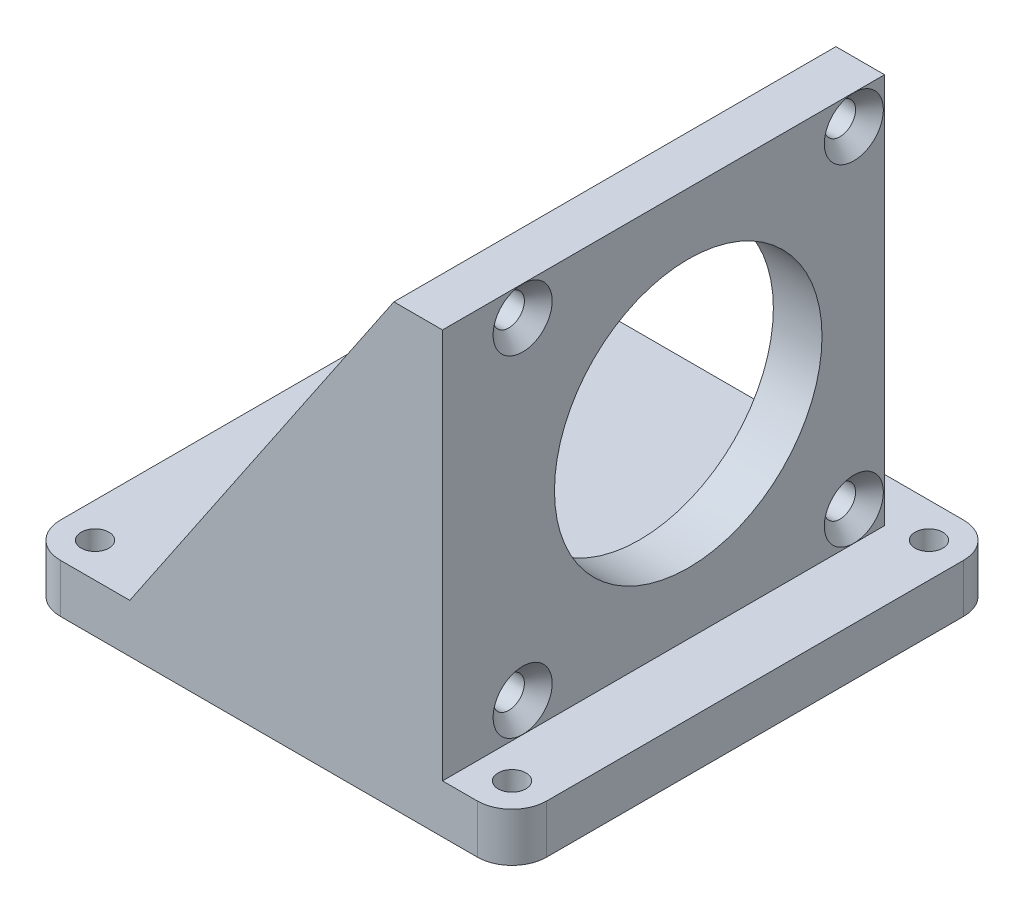
ISO-10303-21;
HEADER;
FILE_DESCRIPTION(('STEP AP214'),'2;1');
FILE_NAME('part.step','',(''),(''),'','','');
FILE_SCHEMA(('AUTOMOTIVE_DESIGN { 1 0 10303 214 1 1 1 1 }'));
ENDSEC;
DATA;
#1=APPLICATION_CONTEXT('core data for automotive mechanical design processes');
#2=APPLICATION_PROTOCOL_DEFINITION('international standard','automotive_design',2000,#1);
#3=PRODUCT_CONTEXT('',#1,'mechanical');
#4=PRODUCT('Part','Part','',(#3));
#5=PRODUCT_RELATED_PRODUCT_CATEGORY('part','',(#4));
#6=PRODUCT_DEFINITION_FORMATION('','',#4);
#7=PRODUCT_DEFINITION_CONTEXT('part definition',#1,'design');
#8=PRODUCT_DEFINITION('design','',#6,#7);
#9=PRODUCT_DEFINITION_SHAPE('','',#8);
#10=(LENGTH_UNIT() NAMED_UNIT(*) SI_UNIT(.MILLI.,.METRE.));
#11=(NAMED_UNIT(*) PLANE_ANGLE_UNIT() SI_UNIT($,.RADIAN.));
#12=(NAMED_UNIT(*) SI_UNIT($,.STERADIAN.) SOLID_ANGLE_UNIT());
#13=UNCERTAINTY_MEASURE_WITH_UNIT(LENGTH_MEASURE(1.E-05),#10,'distance_accuracy_value','');
#14=(GEOMETRIC_REPRESENTATION_CONTEXT(3) GLOBAL_UNCERTAINTY_ASSIGNED_CONTEXT((#13)) GLOBAL_UNIT_ASSIGNED_CONTEXT((#10,
#11,#12)) REPRESENTATION_CONTEXT('',''));
#15=CARTESIAN_POINT('',(0.,0.,0.));
#16=DIRECTION('',(0.,0.,1.));
#17=DIRECTION('',(1.,0.,0.));
#18=AXIS2_PLACEMENT_3D('',#15,#16,#17);
#19=CARTESIAN_POINT('',(8.50000000000001,-28.1,-30.));
#20=DIRECTION('',(0.,1.,0.));
#21=DIRECTION('',(0.,0.,1.));
#22=AXIS2_PLACEMENT_3D('',#19,#20,#21);
#23=PLANE('',#22);
#24=CARTESIAN_POINT('',(-51.5,-28.1,30.));
#25=DIRECTION('',(0.,-1.,0.));
#26=DIRECTION('',(0.,0.,1.));
#27=AXIS2_PLACEMENT_3D('',#24,#25,#26);
#28=CIRCLE('',#27,2.);
#29=CARTESIAN_POINT('',(-51.5,-28.1,32.));
#30=VERTEX_POINT('',#29);
#31=EDGE_CURVE('E426',#30,#30,#28,.T.);
#32=ORIENTED_EDGE('',*,*,#31,.T.);
#33=EDGE_LOOP('',(#32));
#34=FACE_BOUND('',#33,.T.);
#35=CARTESIAN_POINT('',(8.5,-28.1,30.));
#36=DIRECTION('',(0.,-1.,0.));
#37=DIRECTION('',(0.,0.,-1.));
#38=AXIS2_PLACEMENT_3D('',#35,#36,#37);
#39=CIRCLE('',#38,1.99999999999999);
#40=CARTESIAN_POINT('',(8.5,-28.1,28.));
#41=VERTEX_POINT('',#40);
#42=EDGE_CURVE('E356',#41,#41,#39,.T.);
#43=ORIENTED_EDGE('',*,*,#42,.T.);
#44=EDGE_LOOP('',(#43));
#45=FACE_BOUND('',#44,.T.);
#46=CARTESIAN_POINT('',(8.49999999999999,-28.1,-30.));
#47=DIRECTION('',(0.,-1.,0.));
#48=DIRECTION('',(0.,0.,1.));
#49=AXIS2_PLACEMENT_3D('',#46,#47,#48);
#50=CIRCLE('',#49,2.);
#51=CARTESIAN_POINT('',(8.49999999999999,-28.1,-28.));
#52=VERTEX_POINT('',#51);
#53=EDGE_CURVE('E433',#52,#52,#50,.T.);
#54=ORIENTED_EDGE('',*,*,#53,.T.);
#55=EDGE_LOOP('',(#54));
#56=FACE_BOUND('',#55,.T.);
#57=CARTESIAN_POINT('',(-51.5,-28.1,-30.));
#58=DIRECTION('',(0.,-1.,0.));
#59=DIRECTION('',(0.,0.,-1.));
#60=AXIS2_PLACEMENT_3D('',#57,#58,#59);
#61=CIRCLE('',#60,1.99999999999999);
#62=CARTESIAN_POINT('',(-51.5,-28.1,-32.));
#63=VERTEX_POINT('',#62);
#64=EDGE_CURVE('E427',#63,#63,#61,.T.);
#65=ORIENTED_EDGE('',*,*,#64,.T.);
#66=EDGE_LOOP('',(#65));
#67=FACE_BOUND('',#66,.T.);
#68=DIRECTION('',(0.,0.,-1.));
#69=VECTOR('',#68,1.);
#70=CARTESIAN_POINT('',(3.5,-28.1,27.8887116104705));
#71=LINE('',#70,#69);
#72=CARTESIAN_POINT('',(3.5,-28.1,35.));
#73=VERTEX_POINT('',#72);
#74=CARTESIAN_POINT('',(3.5,-28.1,-28.6112883895295));
#75=VERTEX_POINT('',#74);
#76=EDGE_CURVE('E60',#73,#75,#71,.T.);
#77=ORIENTED_EDGE('',*,*,#76,.F.);
#78=DIRECTION('',(-1.,0.,0.));
#79=VECTOR('',#78,1.);
#80=CARTESIAN_POINT('',(-51.5,-28.1,35.));
#81=LINE('',#80,#79);
#82=CARTESIAN_POINT('',(8.49999999999997,-28.1,35.));
#83=VERTEX_POINT('',#82);
#84=EDGE_CURVE('E363',#83,#73,#81,.T.);
#85=ORIENTED_EDGE('',*,*,#84,.F.);
#86=CARTESIAN_POINT('',(8.5,-28.1,30.));
#87=DIRECTION('',(0.,-1.,0.));
#88=DIRECTION('',(0.,0.,-1.));
#89=AXIS2_PLACEMENT_3D('',#86,#87,#88);
#90=CIRCLE('',#89,5.);
#91=CARTESIAN_POINT('',(13.5,-28.1,30.));
#92=VERTEX_POINT('',#91);
#93=EDGE_CURVE('E353',#92,#83,#90,.T.);
#94=ORIENTED_EDGE('',*,*,#93,.F.);
#95=DIRECTION('',(0.,0.,1.));
#96=VECTOR('',#95,1.);
#97=CARTESIAN_POINT('',(13.5,-28.1,30.));
#98=LINE('',#97,#96);
#99=CARTESIAN_POINT('',(13.5,-28.1,-30.));
#100=VERTEX_POINT('',#99);
#101=EDGE_CURVE('E349',#100,#92,#98,.T.);
#102=ORIENTED_EDGE('',*,*,#101,.F.);
#103=CARTESIAN_POINT('',(8.50000000000001,-28.1,-30.));
#104=DIRECTION('',(0.,-1.,0.));
#105=DIRECTION('',(0.,0.,1.));
#106=AXIS2_PLACEMENT_3D('',#103,#104,#105);
#107=CIRCLE('',#106,5.);
#108=CARTESIAN_POINT('',(8.49999999999998,-28.1,-35.));
#109=VERTEX_POINT('',#108);
#110=EDGE_CURVE('E344',#109,#100,#107,.T.);
#111=ORIENTED_EDGE('',*,*,#110,.F.);
#112=DIRECTION('',(1.,0.,0.));
#113=VECTOR('',#112,1.);
#114=CARTESIAN_POINT('',(-51.5,-28.1,-35.));
#115=LINE('',#114,#113);
#116=CARTESIAN_POINT('',(-51.5,-28.1,-35.));
#117=VERTEX_POINT('',#116);
#118=EDGE_CURVE('E330',#117,#109,#115,.T.);
#119=ORIENTED_EDGE('',*,*,#118,.F.);
#120=CARTESIAN_POINT('',(-51.5,-28.1,-30.));
#121=DIRECTION('',(0.,-1.,0.));
#122=DIRECTION('',(0.,0.,1.));
#123=AXIS2_PLACEMENT_3D('',#120,#121,#122);
#124=CIRCLE('',#123,5.);
#125=CARTESIAN_POINT('',(-56.5,-28.1,-30.));
#126=VERTEX_POINT('',#125);
#127=EDGE_CURVE('E340',#126,#117,#124,.T.);
#128=ORIENTED_EDGE('',*,*,#127,.F.);
#129=DIRECTION('',(0.,0.,-1.));
#130=VECTOR('',#129,1.);
#131=CARTESIAN_POINT('',(-56.5,-28.1,30.));
#132=LINE('',#131,#130);
#133=CARTESIAN_POINT('',(-56.5,-28.1,30.));
#134=VERTEX_POINT('',#133);
#135=EDGE_CURVE('E368',#134,#126,#132,.T.);
#136=ORIENTED_EDGE('',*,*,#135,.F.);
#137=CARTESIAN_POINT('',(-51.5,-28.1,30.));
#138=DIRECTION('',(0.,-1.,0.));
#139=DIRECTION('',(0.,0.,1.));
#140=AXIS2_PLACEMENT_3D('',#137,#138,#139);
#141=CIRCLE('',#140,5.);
#142=CARTESIAN_POINT('',(-51.5,-28.1,35.));
#143=VERTEX_POINT('',#142);
#144=EDGE_CURVE('E366',#143,#134,#141,.T.);
#145=ORIENTED_EDGE('',*,*,#144,.F.);
#146=CARTESIAN_POINT('',(-41.5,-28.1,35.));
#147=VERTEX_POINT('',#146);
#148=EDGE_CURVE('E362',#147,#143,#81,.T.);
#149=ORIENTED_EDGE('',*,*,#148,.F.);
#150=DIRECTION('',(0.,0.,-1.));
#151=VECTOR('',#150,1.);
#152=CARTESIAN_POINT('',(-41.5,-28.1,106.996111006081));
#153=LINE('',#152,#151);
#154=CARTESIAN_POINT('',(-41.5,-28.1,27.8887116104705));
#155=VERTEX_POINT('',#154);
#156=EDGE_CURVE('E51',#147,#155,#153,.T.);
#157=ORIENTED_EDGE('',*,*,#156,.T.);
#158=DIRECTION('',(1.,0.,0.));
#159=VECTOR('',#158,1.);
#160=CARTESIAN_POINT('',(3.5,-28.1,27.8887116104705));
#161=LINE('',#160,#159);
#162=CARTESIAN_POINT('',(-3.5,-28.1,27.8887116104705));
#163=VERTEX_POINT('',#162);
#164=EDGE_CURVE('E98',#155,#163,#161,.T.);
#165=ORIENTED_EDGE('',*,*,#164,.T.);
#166=DIRECTION('',(0.,0.,-1.));
#167=VECTOR('',#166,1.);
#168=CARTESIAN_POINT('',(-3.5,-28.1,27.8887116104705));
#169=LINE('',#168,#167);
#170=CARTESIAN_POINT('',(-3.5,-28.1,-28.6112883895295));
#171=VERTEX_POINT('',#170);
#172=EDGE_CURVE('E90',#163,#171,#169,.T.);
#173=ORIENTED_EDGE('',*,*,#172,.T.);
#174=DIRECTION('',(-1.,0.,0.));
#175=VECTOR('',#174,1.);
#176=CARTESIAN_POINT('',(3.5,-28.1,-28.6112883895295));
#177=LINE('',#176,#175);
#178=EDGE_CURVE('E74',#75,#171,#177,.T.);
#179=ORIENTED_EDGE('',*,*,#178,.F.);
#180=EDGE_LOOP('',(#77,#85,#94,#102,#111,#119,#128,#136,#145,#149,#157,#165,#173,#179));
#181=FACE_BOUND('',#180,.T.);
#182=ADVANCED_FACE('F35',(#34,#45,#56,#67,#181),#23,.T.);
#183=CARTESIAN_POINT('',(3.5,0.,0.));
#184=DIRECTION('',(1.,0.,0.));
#185=DIRECTION('',(0.,0.,-1.));
#186=AXIS2_PLACEMENT_3D('',#183,#184,#185);
#187=PLANE('',#186);
#188=CARTESIAN_POINT('',(3.5,-23.8294985259865,-24.1907869155163));
#189=DIRECTION('',(1.,0.,0.));
#190=DIRECTION('',(0.,0.,-1.));
#191=AXIS2_PLACEMENT_3D('',#188,#189,#190);
#192=CIRCLE('',#191,4.24999999999999);
#193=CARTESIAN_POINT('',(3.5,-23.8294985259865,-28.4407869155163));
#194=VERTEX_POINT('',#193);
#195=EDGE_CURVE('E120',#194,#194,#192,.F.);
#196=ORIENTED_EDGE('',*,*,#195,.T.);
#197=EDGE_LOOP('',(#196));
#198=FACE_BOUND('',#197,.T.);
#199=CARTESIAN_POINT('',(3.5,23.8294985259865,-24.1907869155163));
#200=DIRECTION('',(1.,0.,0.));
#201=DIRECTION('',(0.,0.,-1.));
#202=AXIS2_PLACEMENT_3D('',#199,#200,#201);
#203=CIRCLE('',#202,4.24999999999999);
#204=CARTESIAN_POINT('',(3.5,23.8294985259865,-28.4407869155163));
#205=VERTEX_POINT('',#204);
#206=EDGE_CURVE('E117',#205,#205,#203,.F.);
#207=ORIENTED_EDGE('',*,*,#206,.T.);
#208=EDGE_LOOP('',(#207));
#209=FACE_BOUND('',#208,.T.);
#210=CARTESIAN_POINT('',(3.5,-23.8294985259865,23.4682101364572));
#211=DIRECTION('',(1.,0.,0.));
#212=DIRECTION('',(0.,0.,-1.));
#213=AXIS2_PLACEMENT_3D('',#210,#211,#212);
#214=CIRCLE('',#213,4.24999999999999);
#215=CARTESIAN_POINT('',(3.5,-23.8294985259865,19.2182101364572));
#216=VERTEX_POINT('',#215);
#217=EDGE_CURVE('E114',#216,#216,#214,.F.);
#218=ORIENTED_EDGE('',*,*,#217,.T.);
#219=EDGE_LOOP('',(#218));
#220=FACE_BOUND('',#219,.T.);
#221=CARTESIAN_POINT('',(3.5,23.8294985259865,23.4682101364572));
#222=DIRECTION('',(1.,0.,0.));
#223=DIRECTION('',(0.,0.,-1.));
#224=AXIS2_PLACEMENT_3D('',#221,#222,#223);
#225=CIRCLE('',#224,4.24999999999999);
#226=CARTESIAN_POINT('',(3.5,23.8294985259865,19.2182101364573));
#227=VERTEX_POINT('',#226);
#228=EDGE_CURVE('E111',#227,#227,#225,.F.);
#229=ORIENTED_EDGE('',*,*,#228,.T.);
#230=EDGE_LOOP('',(#229));
#231=FACE_BOUND('',#230,.T.);
#232=DIRECTION('',(0.,1.,0.));
#233=VECTOR('',#232,1.);
#234=CARTESIAN_POINT('',(3.5,28.1,-28.6112883895295));
#235=LINE('',#234,#233);
#236=CARTESIAN_POINT('',(3.5,28.1,-28.6112883895295));
#237=VERTEX_POINT('',#236);
#238=EDGE_CURVE('E79',#75,#237,#235,.T.);
#239=ORIENTED_EDGE('',*,*,#238,.T.);
#240=DIRECTION('',(0.,0.,1.));
#241=VECTOR('',#240,1.);
#242=CARTESIAN_POINT('',(3.5,28.1,27.8887116104705));
#243=LINE('',#242,#241);
#244=CARTESIAN_POINT('',(3.5,28.1,35.));
#245=VERTEX_POINT('',#244);
#246=EDGE_CURVE('E101',#237,#245,#243,.T.);
#247=ORIENTED_EDGE('',*,*,#246,.T.);
#248=DIRECTION('',(0.,-1.,0.));
#249=VECTOR('',#248,1.);
#250=CARTESIAN_POINT('',(3.5,-28.1,35.));
#251=LINE('',#250,#249);
#252=EDGE_CURVE('E418',#245,#73,#251,.T.);
#253=ORIENTED_EDGE('',*,*,#252,.T.);
#254=ORIENTED_EDGE('',*,*,#76,.T.);
#255=EDGE_LOOP('',(#239,#247,#253,#254));
#256=FACE_BOUND('',#255,.T.);
#257=CARTESIAN_POINT('',(3.5,0.,-0.36128838952953));
#258=DIRECTION('',(1.,0.,0.));
#259=DIRECTION('',(0.,0.,-1.));
#260=AXIS2_PLACEMENT_3D('',#257,#258,#259);
#261=CIRCLE('',#260,19.25);
#262=CARTESIAN_POINT('',(3.5,0.,-19.6112883895295));
#263=VERTEX_POINT('',#262);
#264=EDGE_CURVE('E94',#263,#263,#261,.T.);
#265=ORIENTED_EDGE('',*,*,#264,.F.);
#266=EDGE_LOOP('',(#265));
#267=FACE_BOUND('',#266,.T.);
#268=ADVANCED_FACE('F146',(#198,#209,#220,#231,#256,#267),#187,.T.);
#269=CARTESIAN_POINT('',(-3.5,0.,0.));
#270=DIRECTION('',(1.,0.,0.));
#271=DIRECTION('',(0.,0.,-1.));
#272=AXIS2_PLACEMENT_3D('',#269,#270,#271);
#273=PLANE('',#272);
#274=DIRECTION('',(0.,1.,0.));
#275=VECTOR('',#274,1.);
#276=CARTESIAN_POINT('',(-3.5,28.1,-28.6112883895295));
#277=LINE('',#276,#275);
#278=CARTESIAN_POINT('',(-3.5,28.1,-28.6112883895295));
#279=VERTEX_POINT('',#278);
#280=EDGE_CURVE('E78',#171,#279,#277,.T.);
#281=ORIENTED_EDGE('',*,*,#280,.F.);
#282=ORIENTED_EDGE('',*,*,#172,.F.);
#283=DIRECTION('',(0.,-1.,0.));
#284=VECTOR('',#283,1.);
#285=CARTESIAN_POINT('',(-3.5,-28.1,27.8887116104705));
#286=LINE('',#285,#284);
#287=CARTESIAN_POINT('',(-3.50000000000002,28.1,27.8887116104705));
#288=VERTEX_POINT('',#287);
#289=EDGE_CURVE('E99',#288,#163,#286,.T.);
#290=ORIENTED_EDGE('',*,*,#289,.F.);
#291=DIRECTION('',(0.,0.,1.));
#292=VECTOR('',#291,1.);
#293=CARTESIAN_POINT('',(-3.5,28.1,27.8887116104705));
#294=LINE('',#293,#292);
#295=EDGE_CURVE('E92',#279,#288,#294,.T.);
#296=ORIENTED_EDGE('',*,*,#295,.F.);
#297=EDGE_LOOP('',(#281,#282,#290,#296));
#298=FACE_BOUND('',#297,.T.);
#299=CARTESIAN_POINT('',(-3.5,0.,-0.36128838952953));
#300=DIRECTION('',(1.,0.,0.));
#301=DIRECTION('',(0.,0.,-1.));
#302=AXIS2_PLACEMENT_3D('',#299,#300,#301);
#303=CIRCLE('',#302,19.25);
#304=CARTESIAN_POINT('',(-3.5,0.,-19.6112883895295));
#305=VERTEX_POINT('',#304);
#306=EDGE_CURVE('E258',#305,#305,#303,.T.);
#307=ORIENTED_EDGE('',*,*,#306,.T.);
#308=EDGE_LOOP('',(#307));
#309=FACE_BOUND('',#308,.T.);
#310=CARTESIAN_POINT('',(-3.5,23.8294985259865,23.4682101364572));
#311=DIRECTION('',(1.,0.,0.));
#312=DIRECTION('',(0.,0.,-1.));
#313=AXIS2_PLACEMENT_3D('',#310,#311,#312);
#314=CIRCLE('',#313,2.25);
#315=CARTESIAN_POINT('',(-3.5,23.8294985259865,21.2182101364572));
#316=VERTEX_POINT('',#315);
#317=EDGE_CURVE('E249',#316,#316,#314,.T.);
#318=ORIENTED_EDGE('',*,*,#317,.T.);
#319=EDGE_LOOP('',(#318));
#320=FACE_BOUND('',#319,.T.);
#321=CARTESIAN_POINT('',(-3.5,23.8294985259865,-24.1907869155163));
#322=DIRECTION('',(1.,0.,0.));
#323=DIRECTION('',(0.,0.,1.));
#324=AXIS2_PLACEMENT_3D('',#321,#322,#323);
#325=CIRCLE('',#324,2.25);
#326=CARTESIAN_POINT('',(-3.5,23.8294985259865,-21.9407869155163));
#327=VERTEX_POINT('',#326);
#328=EDGE_CURVE('E245',#327,#327,#325,.T.);
#329=ORIENTED_EDGE('',*,*,#328,.T.);
#330=EDGE_LOOP('',(#329));
#331=FACE_BOUND('',#330,.T.);
#332=CARTESIAN_POINT('',(-3.5,-23.8294985259865,-24.1907869155163));
#333=DIRECTION('',(1.,0.,0.));
#334=DIRECTION('',(0.,0.,-1.));
#335=AXIS2_PLACEMENT_3D('',#332,#333,#334);
#336=CIRCLE('',#335,2.25);
#337=CARTESIAN_POINT('',(-3.5,-23.8294985259865,-26.4407869155163));
#338=VERTEX_POINT('',#337);
#339=EDGE_CURVE('E243',#338,#338,#336,.T.);
#340=ORIENTED_EDGE('',*,*,#339,.T.);
#341=EDGE_LOOP('',(#340));
#342=FACE_BOUND('',#341,.T.);
#343=CARTESIAN_POINT('',(-3.5,-23.8294985259865,23.4682101364572));
#344=DIRECTION('',(1.,0.,0.));
#345=DIRECTION('',(0.,0.,1.));
#346=AXIS2_PLACEMENT_3D('',#343,#344,#345);
#347=CIRCLE('',#346,2.25);
#348=CARTESIAN_POINT('',(-3.5,-23.8294985259865,25.7182101364572));
#349=VERTEX_POINT('',#348);
#350=EDGE_CURVE('E246',#349,#349,#347,.T.);
#351=ORIENTED_EDGE('',*,*,#350,.T.);
#352=EDGE_LOOP('',(#351));
#353=FACE_BOUND('',#352,.T.);
#354=ADVANCED_FACE('F86',(#298,#309,#320,#331,#342,#353),#273,.F.);
#355=CARTESIAN_POINT('',(3.5,28.1,-28.6112883895295));
#356=DIRECTION('',(0.,0.,1.));
#357=DIRECTION('',(1.,0.,0.));
#358=AXIS2_PLACEMENT_3D('',#355,#356,#357);
#359=PLANE('',#358);
#360=ORIENTED_EDGE('',*,*,#280,.T.);
#361=DIRECTION('',(-1.,0.,0.));
#362=VECTOR('',#361,1.);
#363=CARTESIAN_POINT('',(3.5,28.1,-28.6112883895295));
#364=LINE('',#363,#362);
#365=EDGE_CURVE('E82',#237,#279,#364,.T.);
#366=ORIENTED_EDGE('',*,*,#365,.F.);
#367=ORIENTED_EDGE('',*,*,#238,.F.);
#368=ORIENTED_EDGE('',*,*,#178,.T.);
#369=EDGE_LOOP('',(#360,#366,#367,#368));
#370=FACE_BOUND('',#369,.T.);
#371=ADVANCED_FACE('F76',(#370),#359,.F.);
#372=CARTESIAN_POINT('',(3.5,28.1,27.8887116104705));
#373=DIRECTION('',(0.,-1.,0.));
#374=DIRECTION('',(0.,0.,-1.));
#375=AXIS2_PLACEMENT_3D('',#372,#373,#374);
#376=PLANE('',#375);
#377=ORIENTED_EDGE('',*,*,#295,.T.);
#378=DIRECTION('',(0.,0.,-1.));
#379=VECTOR('',#378,1.);
#380=CARTESIAN_POINT('',(-3.50000000000002,28.1,106.996111006081));
#381=LINE('',#380,#379);
#382=CARTESIAN_POINT('',(-3.50000000000002,28.1,35.));
#383=VERTEX_POINT('',#382);
#384=EDGE_CURVE('E270',#383,#288,#381,.T.);
#385=ORIENTED_EDGE('',*,*,#384,.F.);
#386=DIRECTION('',(1.,0.,0.));
#387=VECTOR('',#386,1.);
#388=CARTESIAN_POINT('',(3.49999999999999,28.1,35.));
#389=LINE('',#388,#387);
#390=EDGE_CURVE('E416',#383,#245,#389,.T.);
#391=ORIENTED_EDGE('',*,*,#390,.T.);
#392=ORIENTED_EDGE('',*,*,#246,.F.);
#393=ORIENTED_EDGE('',*,*,#365,.T.);
#394=EDGE_LOOP('',(#377,#385,#391,#392,#393));
#395=FACE_BOUND('',#394,.T.);
#396=ADVANCED_FACE('F209',(#395),#376,.F.);
#397=CARTESIAN_POINT('',(3.5,0.,-0.36128838952953));
#398=DIRECTION('',(-1.,0.,0.));
#399=DIRECTION('',(0.,0.,1.));
#400=AXIS2_PLACEMENT_3D('',#397,#398,#399);
#401=CYLINDRICAL_SURFACE('',#400,19.25);
#402=ORIENTED_EDGE('',*,*,#264,.T.);
#403=EDGE_LOOP('',(#402));
#404=FACE_BOUND('',#403,.T.);
#405=ORIENTED_EDGE('',*,*,#306,.F.);
#406=EDGE_LOOP('',(#405));
#407=FACE_BOUND('',#406,.T.);
#408=ADVANCED_FACE('F206',(#404,#407),#401,.F.);
#409=CARTESIAN_POINT('',(3.5,23.8294985259865,23.4682101364572));
#410=DIRECTION('',(-1.,0.,0.));
#411=DIRECTION('',(0.,0.,1.));
#412=AXIS2_PLACEMENT_3D('',#409,#410,#411);
#413=CYLINDRICAL_SURFACE('',#412,2.25);
#414=CARTESIAN_POINT('',(1.5,23.8294985259865,23.4682101364572));
#415=DIRECTION('',(1.,0.,0.));
#416=DIRECTION('',(0.,0.,-1.));
#417=AXIS2_PLACEMENT_3D('',#414,#415,#416);
#418=CIRCLE('',#417,2.25);
#419=CARTESIAN_POINT('',(1.5,23.8294985259865,21.2182101364572));
#420=VERTEX_POINT('',#419);
#421=EDGE_CURVE('E11',#420,#420,#418,.T.);
#422=ORIENTED_EDGE('',*,*,#421,.T.);
#423=EDGE_LOOP('',(#422));
#424=FACE_BOUND('',#423,.T.);
#425=ORIENTED_EDGE('',*,*,#317,.F.);
#426=EDGE_LOOP('',(#425));
#427=FACE_BOUND('',#426,.T.);
#428=ADVANCED_FACE('F202',(#424,#427),#413,.F.);
#429=CARTESIAN_POINT('',(3.5,23.8294985259865,-24.1907869155163));
#430=DIRECTION('',(-1.,0.,0.));
#431=DIRECTION('',(0.,0.,1.));
#432=AXIS2_PLACEMENT_3D('',#429,#430,#431);
#433=CYLINDRICAL_SURFACE('',#432,2.25);
#434=CARTESIAN_POINT('',(1.5,23.8294985259865,-24.1907869155163));
#435=DIRECTION('',(1.,0.,0.));
#436=DIRECTION('',(0.,0.,-1.));
#437=AXIS2_PLACEMENT_3D('',#434,#435,#436);
#438=CIRCLE('',#437,2.25);
#439=CARTESIAN_POINT('',(1.5,23.8294985259865,-26.4407869155163));
#440=VERTEX_POINT('',#439);
#441=EDGE_CURVE('E123',#440,#440,#438,.T.);
#442=ORIENTED_EDGE('',*,*,#441,.T.);
#443=EDGE_LOOP('',(#442));
#444=FACE_BOUND('',#443,.T.);
#445=ORIENTED_EDGE('',*,*,#328,.F.);
#446=EDGE_LOOP('',(#445));
#447=FACE_BOUND('',#446,.T.);
#448=ADVANCED_FACE('F198',(#444,#447),#433,.F.);
#449=CARTESIAN_POINT('',(3.5,-23.8294985259865,-24.1907869155163));
#450=DIRECTION('',(-1.,0.,0.));
#451=DIRECTION('',(0.,0.,1.));
#452=AXIS2_PLACEMENT_3D('',#449,#450,#451);
#453=CYLINDRICAL_SURFACE('',#452,2.25);
#454=CARTESIAN_POINT('',(1.5,-23.8294985259865,-24.1907869155163));
#455=DIRECTION('',(1.,0.,0.));
#456=DIRECTION('',(0.,0.,-1.));
#457=AXIS2_PLACEMENT_3D('',#454,#455,#456);
#458=CIRCLE('',#457,2.25);
#459=CARTESIAN_POINT('',(1.5,-23.8294985259865,-26.4407869155163));
#460=VERTEX_POINT('',#459);
#461=EDGE_CURVE('E108',#460,#460,#458,.T.);
#462=ORIENTED_EDGE('',*,*,#461,.T.);
#463=EDGE_LOOP('',(#462));
#464=FACE_BOUND('',#463,.T.);
#465=ORIENTED_EDGE('',*,*,#339,.F.);
#466=EDGE_LOOP('',(#465));
#467=FACE_BOUND('',#466,.T.);
#468=ADVANCED_FACE('F195',(#464,#467),#453,.F.);
#469=CARTESIAN_POINT('',(3.5,-23.8294985259865,23.4682101364572));
#470=DIRECTION('',(-1.,0.,0.));
#471=DIRECTION('',(0.,0.,1.));
#472=AXIS2_PLACEMENT_3D('',#469,#470,#471);
#473=CYLINDRICAL_SURFACE('',#472,2.25);
#474=CARTESIAN_POINT('',(1.5,-23.8294985259865,23.4682101364572));
#475=DIRECTION('',(1.,0.,0.));
#476=DIRECTION('',(0.,0.,-1.));
#477=AXIS2_PLACEMENT_3D('',#474,#475,#476);
#478=CIRCLE('',#477,2.25);
#479=CARTESIAN_POINT('',(1.5,-23.8294985259865,21.2182101364572));
#480=VERTEX_POINT('',#479);
#481=EDGE_CURVE('E44',#480,#480,#478,.T.);
#482=ORIENTED_EDGE('',*,*,#481,.T.);
#483=EDGE_LOOP('',(#482));
#484=FACE_BOUND('',#483,.T.);
#485=ORIENTED_EDGE('',*,*,#350,.F.);
#486=EDGE_LOOP('',(#485));
#487=FACE_BOUND('',#486,.T.);
#488=ADVANCED_FACE('F128',(#484,#487),#473,.F.);
#489=CARTESIAN_POINT('',(8.50000000000001,-35.1,-30.));
#490=DIRECTION('',(0.,1.,0.));
#491=DIRECTION('',(0.,0.,1.));
#492=AXIS2_PLACEMENT_3D('',#489,#490,#491);
#493=PLANE('',#492);
#494=CARTESIAN_POINT('',(8.50000000000001,-35.1,-30.));
#495=DIRECTION('',(0.,-1.,0.));
#496=DIRECTION('',(0.,0.,1.));
#497=AXIS2_PLACEMENT_3D('',#494,#495,#496);
#498=CIRCLE('',#497,5.);
#499=CARTESIAN_POINT('',(8.49999999999998,-35.1,-35.));
#500=VERTEX_POINT('',#499);
#501=CARTESIAN_POINT('',(13.5,-35.1,-30.));
#502=VERTEX_POINT('',#501);
#503=EDGE_CURVE('E339',#500,#502,#498,.T.);
#504=ORIENTED_EDGE('',*,*,#503,.T.);
#505=DIRECTION('',(0.,0.,1.));
#506=VECTOR('',#505,1.);
#507=CARTESIAN_POINT('',(13.5,-35.1,30.));
#508=LINE('',#507,#506);
#509=CARTESIAN_POINT('',(13.5,-35.1,30.));
#510=VERTEX_POINT('',#509);
#511=EDGE_CURVE('E387',#502,#510,#508,.T.);
#512=ORIENTED_EDGE('',*,*,#511,.T.);
#513=CARTESIAN_POINT('',(8.5,-35.1,30.));
#514=DIRECTION('',(0.,-1.,0.));
#515=DIRECTION('',(0.,0.,-1.));
#516=AXIS2_PLACEMENT_3D('',#513,#514,#515);
#517=CIRCLE('',#516,5.);
#518=CARTESIAN_POINT('',(8.49999999999997,-35.1,35.));
#519=VERTEX_POINT('',#518);
#520=EDGE_CURVE('E390',#510,#519,#517,.T.);
#521=ORIENTED_EDGE('',*,*,#520,.T.);
#522=DIRECTION('',(-1.,0.,0.));
#523=VECTOR('',#522,1.);
#524=CARTESIAN_POINT('',(-51.5,-35.1,35.));
#525=LINE('',#524,#523);
#526=CARTESIAN_POINT('',(-51.5,-35.1,35.));
#527=VERTEX_POINT('',#526);
#528=EDGE_CURVE('E397',#519,#527,#525,.T.);
#529=ORIENTED_EDGE('',*,*,#528,.T.);
#530=CARTESIAN_POINT('',(-51.5,-35.1,30.));
#531=DIRECTION('',(0.,-1.,0.));
#532=DIRECTION('',(0.,0.,1.));
#533=AXIS2_PLACEMENT_3D('',#530,#531,#532);
#534=CIRCLE('',#533,5.);
#535=CARTESIAN_POINT('',(-56.5,-35.1,30.));
#536=VERTEX_POINT('',#535);
#537=EDGE_CURVE('E399',#527,#536,#534,.T.);
#538=ORIENTED_EDGE('',*,*,#537,.T.);
#539=DIRECTION('',(0.,0.,-1.));
#540=VECTOR('',#539,1.);
#541=CARTESIAN_POINT('',(-56.5,-35.1,30.));
#542=LINE('',#541,#540);
#543=CARTESIAN_POINT('',(-56.5,-35.1,-30.));
#544=VERTEX_POINT('',#543);
#545=EDGE_CURVE('E401',#536,#544,#542,.T.);
#546=ORIENTED_EDGE('',*,*,#545,.T.);
#547=CARTESIAN_POINT('',(-51.5,-35.1,-30.));
#548=DIRECTION('',(0.,-1.,0.));
#549=DIRECTION('',(0.,0.,1.));
#550=AXIS2_PLACEMENT_3D('',#547,#548,#549);
#551=CIRCLE('',#550,5.);
#552=CARTESIAN_POINT('',(-51.5,-35.1,-35.));
#553=VERTEX_POINT('',#552);
#554=EDGE_CURVE('E402',#544,#553,#551,.T.);
#555=ORIENTED_EDGE('',*,*,#554,.T.);
#556=DIRECTION('',(1.,0.,0.));
#557=VECTOR('',#556,1.);
#558=CARTESIAN_POINT('',(-51.5,-35.1,-35.));
#559=LINE('',#558,#557);
#560=EDGE_CURVE('E346',#553,#500,#559,.T.);
#561=ORIENTED_EDGE('',*,*,#560,.T.);
#562=EDGE_LOOP('',(#504,#512,#521,#529,#538,#546,#555,#561));
#563=FACE_BOUND('',#562,.T.);
#564=CARTESIAN_POINT('',(8.5,-35.1,30.));
#565=DIRECTION('',(0.,-1.,0.));
#566=DIRECTION('',(0.,0.,-1.));
#567=AXIS2_PLACEMENT_3D('',#564,#565,#566);
#568=CIRCLE('',#567,1.99999999999999);
#569=CARTESIAN_POINT('',(8.5,-35.1,28.));
#570=VERTEX_POINT('',#569);
#571=EDGE_CURVE('E351',#570,#570,#568,.T.);
#572=ORIENTED_EDGE('',*,*,#571,.F.);
#573=EDGE_LOOP('',(#572));
#574=FACE_BOUND('',#573,.T.);
#575=CARTESIAN_POINT('',(8.49999999999999,-35.1,-30.));
#576=DIRECTION('',(0.,-1.,0.));
#577=DIRECTION('',(0.,0.,1.));
#578=AXIS2_PLACEMENT_3D('',#575,#576,#577);
#579=CIRCLE('',#578,2.);
#580=CARTESIAN_POINT('',(8.49999999999999,-35.1,-28.));
#581=VERTEX_POINT('',#580);
#582=EDGE_CURVE('E435',#581,#581,#579,.T.);
#583=ORIENTED_EDGE('',*,*,#582,.F.);
#584=EDGE_LOOP('',(#583));
#585=FACE_BOUND('',#584,.T.);
#586=CARTESIAN_POINT('',(-51.5,-35.1,30.));
#587=DIRECTION('',(0.,-1.,0.));
#588=DIRECTION('',(0.,0.,1.));
#589=AXIS2_PLACEMENT_3D('',#586,#587,#588);
#590=CIRCLE('',#589,2.);
#591=CARTESIAN_POINT('',(-51.5,-35.1,32.));
#592=VERTEX_POINT('',#591);
#593=EDGE_CURVE('E430',#592,#592,#590,.T.);
#594=ORIENTED_EDGE('',*,*,#593,.F.);
#595=EDGE_LOOP('',(#594));
#596=FACE_BOUND('',#595,.T.);
#597=CARTESIAN_POINT('',(-51.5,-35.1,-30.));
#598=DIRECTION('',(0.,-1.,0.));
#599=DIRECTION('',(0.,0.,-1.));
#600=AXIS2_PLACEMENT_3D('',#597,#598,#599);
#601=CIRCLE('',#600,1.99999999999999);
#602=CARTESIAN_POINT('',(-51.5,-35.1,-32.));
#603=VERTEX_POINT('',#602);
#604=EDGE_CURVE('E423',#603,#603,#601,.T.);
#605=ORIENTED_EDGE('',*,*,#604,.F.);
#606=EDGE_LOOP('',(#605));
#607=FACE_BOUND('',#606,.T.);
#608=ADVANCED_FACE('F158',(#563,#574,#585,#596,#607),#493,.F.);
#609=CARTESIAN_POINT('',(8.50000000000001,-35.1,-30.));
#610=DIRECTION('',(0.,1.,0.));
#611=DIRECTION('',(0.,0.,1.));
#612=AXIS2_PLACEMENT_3D('',#609,#610,#611);
#613=CYLINDRICAL_SURFACE('',#612,5.);
#614=ORIENTED_EDGE('',*,*,#110,.T.);
#615=DIRECTION('',(0.,1.,0.));
#616=VECTOR('',#615,1.);
#617=CARTESIAN_POINT('',(13.5,-35.1,-30.));
#618=LINE('',#617,#616);
#619=EDGE_CURVE('E252',#502,#100,#618,.T.);
#620=ORIENTED_EDGE('',*,*,#619,.F.);
#621=ORIENTED_EDGE('',*,*,#503,.F.);
#622=DIRECTION('',(0.,1.,0.));
#623=VECTOR('',#622,1.);
#624=CARTESIAN_POINT('',(8.49999999999998,-35.1,-35.));
#625=LINE('',#624,#623);
#626=EDGE_CURVE('E333',#500,#109,#625,.T.);
#627=ORIENTED_EDGE('',*,*,#626,.T.);
#628=EDGE_LOOP('',(#614,#620,#621,#627));
#629=FACE_BOUND('',#628,.T.);
#630=ADVANCED_FACE('F188',(#629),#613,.T.);
#631=CARTESIAN_POINT('',(13.5,-35.1,30.));
#632=DIRECTION('',(-1.,0.,0.));
#633=DIRECTION('',(0.,0.,1.));
#634=AXIS2_PLACEMENT_3D('',#631,#632,#633);
#635=PLANE('',#634);
#636=ORIENTED_EDGE('',*,*,#101,.T.);
#637=DIRECTION('',(0.,1.,0.));
#638=VECTOR('',#637,1.);
#639=CARTESIAN_POINT('',(13.5,-35.1,30.));
#640=LINE('',#639,#638);
#641=EDGE_CURVE('E384',#510,#92,#640,.T.);
#642=ORIENTED_EDGE('',*,*,#641,.F.);
#643=ORIENTED_EDGE('',*,*,#511,.F.);
#644=ORIENTED_EDGE('',*,*,#619,.T.);
#645=EDGE_LOOP('',(#636,#642,#643,#644));
#646=FACE_BOUND('',#645,.T.);
#647=ADVANCED_FACE('F184',(#646),#635,.F.);
#648=CARTESIAN_POINT('',(8.5,-35.1,30.));
#649=DIRECTION('',(0.,1.,0.));
#650=DIRECTION('',(0.,0.,1.));
#651=AXIS2_PLACEMENT_3D('',#648,#649,#650);
#652=CYLINDRICAL_SURFACE('',#651,5.);
#653=ORIENTED_EDGE('',*,*,#93,.T.);
#654=DIRECTION('',(0.,1.,0.));
#655=VECTOR('',#654,1.);
#656=CARTESIAN_POINT('',(8.49999999999997,-35.1,35.));
#657=LINE('',#656,#655);
#658=EDGE_CURVE('E381',#519,#83,#657,.T.);
#659=ORIENTED_EDGE('',*,*,#658,.F.);
#660=ORIENTED_EDGE('',*,*,#520,.F.);
#661=ORIENTED_EDGE('',*,*,#641,.T.);
#662=EDGE_LOOP('',(#653,#659,#660,#661));
#663=FACE_BOUND('',#662,.T.);
#664=ADVANCED_FACE('F180',(#663),#652,.T.);
#665=CARTESIAN_POINT('',(-51.5,-35.1,35.));
#666=DIRECTION('',(0.,0.,-1.));
#667=DIRECTION('',(-1.,0.,0.));
#668=AXIS2_PLACEMENT_3D('',#665,#666,#667);
#669=PLANE('',#668);
#670=ORIENTED_EDGE('',*,*,#84,.T.);
#671=ORIENTED_EDGE('',*,*,#252,.F.);
#672=ORIENTED_EDGE('',*,*,#390,.F.);
#673=DIRECTION('',(0.560130896628071,0.828404115539411,0.));
#674=VECTOR('',#673,1.);
#675=CARTESIAN_POINT('',(-27.3814020389185,-7.21933669966367,35.));
#676=LINE('',#675,#674);
#677=EDGE_CURVE('E414',#147,#383,#676,.T.);
#678=ORIENTED_EDGE('',*,*,#677,.F.);
#679=ORIENTED_EDGE('',*,*,#148,.T.);
#680=DIRECTION('',(0.,1.,0.));
#681=VECTOR('',#680,1.);
#682=CARTESIAN_POINT('',(-51.5,-35.1,35.));
#683=LINE('',#682,#681);
#684=EDGE_CURVE('E378',#527,#143,#683,.T.);
#685=ORIENTED_EDGE('',*,*,#684,.F.);
#686=ORIENTED_EDGE('',*,*,#528,.F.);
#687=ORIENTED_EDGE('',*,*,#658,.T.);
#688=EDGE_LOOP('',(#670,#671,#672,#678,#679,#685,#686,#687));
#689=FACE_BOUND('',#688,.T.);
#690=ADVANCED_FACE('F176',(#689),#669,.F.);
#691=CARTESIAN_POINT('',(-51.5,-35.1,30.));
#692=DIRECTION('',(0.,1.,0.));
#693=DIRECTION('',(0.,0.,1.));
#694=AXIS2_PLACEMENT_3D('',#691,#692,#693);
#695=CYLINDRICAL_SURFACE('',#694,5.);
#696=ORIENTED_EDGE('',*,*,#144,.T.);
#697=DIRECTION('',(0.,1.,0.));
#698=VECTOR('',#697,1.);
#699=CARTESIAN_POINT('',(-56.5,-35.1,30.));
#700=LINE('',#699,#698);
#701=EDGE_CURVE('E375',#536,#134,#700,.T.);
#702=ORIENTED_EDGE('',*,*,#701,.F.);
#703=ORIENTED_EDGE('',*,*,#537,.F.);
#704=ORIENTED_EDGE('',*,*,#684,.T.);
#705=EDGE_LOOP('',(#696,#702,#703,#704));
#706=FACE_BOUND('',#705,.T.);
#707=ADVANCED_FACE('F172',(#706),#695,.T.);
#708=CARTESIAN_POINT('',(-56.5,-35.1,30.));
#709=DIRECTION('',(1.,0.,0.));
#710=DIRECTION('',(0.,0.,-1.));
#711=AXIS2_PLACEMENT_3D('',#708,#709,#710);
#712=PLANE('',#711);
#713=ORIENTED_EDGE('',*,*,#135,.T.);
#714=DIRECTION('',(0.,1.,0.));
#715=VECTOR('',#714,1.);
#716=CARTESIAN_POINT('',(-56.5,-35.1,-30.));
#717=LINE('',#716,#715);
#718=EDGE_CURVE('E372',#544,#126,#717,.T.);
#719=ORIENTED_EDGE('',*,*,#718,.F.);
#720=ORIENTED_EDGE('',*,*,#545,.F.);
#721=ORIENTED_EDGE('',*,*,#701,.T.);
#722=EDGE_LOOP('',(#713,#719,#720,#721));
#723=FACE_BOUND('',#722,.T.);
#724=ADVANCED_FACE('F168',(#723),#712,.F.);
#725=CARTESIAN_POINT('',(-51.5,-35.1,-30.));
#726=DIRECTION('',(0.,1.,0.));
#727=DIRECTION('',(0.,0.,1.));
#728=AXIS2_PLACEMENT_3D('',#725,#726,#727);
#729=CYLINDRICAL_SURFACE('',#728,5.);
#730=ORIENTED_EDGE('',*,*,#127,.T.);
#731=DIRECTION('',(0.,1.,0.));
#732=VECTOR('',#731,1.);
#733=CARTESIAN_POINT('',(-51.5,-35.1,-35.));
#734=LINE('',#733,#732);
#735=EDGE_CURVE('E336',#553,#117,#734,.T.);
#736=ORIENTED_EDGE('',*,*,#735,.F.);
#737=ORIENTED_EDGE('',*,*,#554,.F.);
#738=ORIENTED_EDGE('',*,*,#718,.T.);
#739=EDGE_LOOP('',(#730,#736,#737,#738));
#740=FACE_BOUND('',#739,.T.);
#741=ADVANCED_FACE('F164',(#740),#729,.T.);
#742=CARTESIAN_POINT('',(-51.5,-35.1,-35.));
#743=DIRECTION('',(0.,0.,1.));
#744=DIRECTION('',(1.,0.,0.));
#745=AXIS2_PLACEMENT_3D('',#742,#743,#744);
#746=PLANE('',#745);
#747=ORIENTED_EDGE('',*,*,#118,.T.);
#748=ORIENTED_EDGE('',*,*,#626,.F.);
#749=ORIENTED_EDGE('',*,*,#560,.F.);
#750=ORIENTED_EDGE('',*,*,#735,.T.);
#751=EDGE_LOOP('',(#747,#748,#749,#750));
#752=FACE_BOUND('',#751,.T.);
#753=ADVANCED_FACE('F160',(#752),#746,.F.);
#754=CARTESIAN_POINT('',(8.5,-35.1,30.));
#755=DIRECTION('',(0.,1.,0.));
#756=DIRECTION('',(0.,0.,1.));
#757=AXIS2_PLACEMENT_3D('',#754,#755,#756);
#758=CYLINDRICAL_SURFACE('',#757,1.99999999999999);
#759=ORIENTED_EDGE('',*,*,#571,.T.);
#760=EDGE_LOOP('',(#759));
#761=FACE_BOUND('',#760,.T.);
#762=ORIENTED_EDGE('',*,*,#42,.F.);
#763=EDGE_LOOP('',(#762));
#764=FACE_BOUND('',#763,.T.);
#765=ADVANCED_FACE('F163',(#761,#764),#758,.F.);
#766=CARTESIAN_POINT('',(8.49999999999999,-35.1,-30.));
#767=DIRECTION('',(0.,1.,0.));
#768=DIRECTION('',(0.,0.,1.));
#769=AXIS2_PLACEMENT_3D('',#766,#767,#768);
#770=CYLINDRICAL_SURFACE('',#769,2.);
#771=ORIENTED_EDGE('',*,*,#582,.T.);
#772=EDGE_LOOP('',(#771));
#773=FACE_BOUND('',#772,.T.);
#774=ORIENTED_EDGE('',*,*,#53,.F.);
#775=EDGE_LOOP('',(#774));
#776=FACE_BOUND('',#775,.T.);
#777=ADVANCED_FACE('F443',(#773,#776),#770,.F.);
#778=CARTESIAN_POINT('',(-51.5,-35.1,30.));
#779=DIRECTION('',(0.,1.,0.));
#780=DIRECTION('',(0.,0.,1.));
#781=AXIS2_PLACEMENT_3D('',#778,#779,#780);
#782=CYLINDRICAL_SURFACE('',#781,2.);
#783=ORIENTED_EDGE('',*,*,#593,.T.);
#784=EDGE_LOOP('',(#783));
#785=FACE_BOUND('',#784,.T.);
#786=ORIENTED_EDGE('',*,*,#31,.F.);
#787=EDGE_LOOP('',(#786));
#788=FACE_BOUND('',#787,.T.);
#789=ADVANCED_FACE('F445',(#785,#788),#782,.F.);
#790=CARTESIAN_POINT('',(-51.5,-35.1,-30.));
#791=DIRECTION('',(0.,1.,0.));
#792=DIRECTION('',(0.,0.,1.));
#793=AXIS2_PLACEMENT_3D('',#790,#791,#792);
#794=CYLINDRICAL_SURFACE('',#793,1.99999999999999);
#795=ORIENTED_EDGE('',*,*,#604,.T.);
#796=EDGE_LOOP('',(#795));
#797=FACE_BOUND('',#796,.T.);
#798=ORIENTED_EDGE('',*,*,#64,.F.);
#799=EDGE_LOOP('',(#798));
#800=FACE_BOUND('',#799,.T.);
#801=ADVANCED_FACE('F452',(#797,#800),#794,.F.);
#802=CARTESIAN_POINT('',(0.,0.,27.8887116104705));
#803=DIRECTION('',(0.,0.,1.));
#804=DIRECTION('',(1.,0.,0.));
#805=AXIS2_PLACEMENT_3D('',#802,#803,#804);
#806=PLANE('',#805);
#807=DIRECTION('',(-0.560130896628071,-0.828404115539411,0.));
#808=VECTOR('',#807,1.);
#809=CARTESIAN_POINT('',(-27.3814020389185,-7.21933669966367,27.8887116104705));
#810=LINE('',#809,#808);
#811=EDGE_CURVE('E276',#288,#155,#810,.T.);
#812=ORIENTED_EDGE('',*,*,#811,.F.);
#813=ORIENTED_EDGE('',*,*,#289,.T.);
#814=ORIENTED_EDGE('',*,*,#164,.F.);
#815=EDGE_LOOP('',(#812,#813,#814));
#816=FACE_BOUND('',#815,.T.);
#817=ADVANCED_FACE('F235',(#816),#806,.F.);
#818=CARTESIAN_POINT('',(-27.3814020389185,-7.21933669966367,106.996111006081));
#819=DIRECTION('',(0.828404115539411,-0.560130896628071,0.));
#820=DIRECTION('',(0.560130896628071,0.828404115539411,0.));
#821=AXIS2_PLACEMENT_3D('',#818,#819,#820);
#822=PLANE('',#821);
#823=ORIENTED_EDGE('',*,*,#156,.F.);
#824=ORIENTED_EDGE('',*,*,#677,.T.);
#825=ORIENTED_EDGE('',*,*,#384,.T.);
#826=ORIENTED_EDGE('',*,*,#811,.T.);
#827=EDGE_LOOP('',(#823,#824,#825,#826));
#828=FACE_BOUND('',#827,.T.);
#829=ADVANCED_FACE('F224',(#828),#822,.F.);
#830=CARTESIAN_POINT('',(1.5,-23.8294985259865,-24.1907869155163));
#831=DIRECTION('',(1.,0.,0.));
#832=DIRECTION('',(0.,0.,-1.));
#833=AXIS2_PLACEMENT_3D('',#830,#831,#832);
#834=CONICAL_SURFACE('',#833,2.25,0.785398163397446);
#835=ORIENTED_EDGE('',*,*,#195,.F.);
#836=EDGE_LOOP('',(#835));
#837=FACE_BOUND('',#836,.T.);
#838=ORIENTED_EDGE('',*,*,#461,.F.);
#839=EDGE_LOOP('',(#838));
#840=FACE_BOUND('',#839,.T.);
#841=ADVANCED_FACE('F140',(#837,#840),#834,.F.);
#842=CARTESIAN_POINT('',(1.5,23.8294985259865,-24.1907869155163));
#843=DIRECTION('',(1.,0.,0.));
#844=DIRECTION('',(0.,0.,-1.));
#845=AXIS2_PLACEMENT_3D('',#842,#843,#844);
#846=CONICAL_SURFACE('',#845,2.25,0.785398163397446);
#847=ORIENTED_EDGE('',*,*,#206,.F.);
#848=EDGE_LOOP('',(#847));
#849=FACE_BOUND('',#848,.T.);
#850=ORIENTED_EDGE('',*,*,#441,.F.);
#851=EDGE_LOOP('',(#850));
#852=FACE_BOUND('',#851,.T.);
#853=ADVANCED_FACE('F133',(#849,#852),#846,.F.);
#854=CARTESIAN_POINT('',(1.5,-23.8294985259865,23.4682101364572));
#855=DIRECTION('',(1.,0.,0.));
#856=DIRECTION('',(0.,0.,-1.));
#857=AXIS2_PLACEMENT_3D('',#854,#855,#856);
#858=CONICAL_SURFACE('',#857,2.25,0.785398163397446);
#859=ORIENTED_EDGE('',*,*,#217,.F.);
#860=EDGE_LOOP('',(#859));
#861=FACE_BOUND('',#860,.T.);
#862=ORIENTED_EDGE('',*,*,#481,.F.);
#863=EDGE_LOOP('',(#862));
#864=FACE_BOUND('',#863,.T.);
#865=ADVANCED_FACE('F131',(#861,#864),#858,.F.);
#866=CARTESIAN_POINT('',(1.5,23.8294985259865,23.4682101364572));
#867=DIRECTION('',(1.,0.,0.));
#868=DIRECTION('',(0.,0.,-1.));
#869=AXIS2_PLACEMENT_3D('',#866,#867,#868);
#870=CONICAL_SURFACE('',#869,2.25,0.785398163397446);
#871=ORIENTED_EDGE('',*,*,#228,.F.);
#872=EDGE_LOOP('',(#871));
#873=FACE_BOUND('',#872,.T.);
#874=ORIENTED_EDGE('',*,*,#421,.F.);
#875=EDGE_LOOP('',(#874));
#876=FACE_BOUND('',#875,.T.);
#877=ADVANCED_FACE('F38',(#873,#876),#870,.F.);
#878=CLOSED_SHELL('',(#182,#268,#354,#371,#396,#408,#428,#448,#468,#488,#608,#630,#647,#664,
#690,#707,#724,#741,#753,#765,#777,#789,#801,#817,#829,#841,#853,#865,#877));
#879=MANIFOLD_SOLID_BREP('B2',#878);
#880=ADVANCED_BREP_SHAPE_REPRESENTATION('',(#18,#879),#14);
#881=SHAPE_DEFINITION_REPRESENTATION(#9,#880);
ENDSEC;
END-ISO-10303-21;
